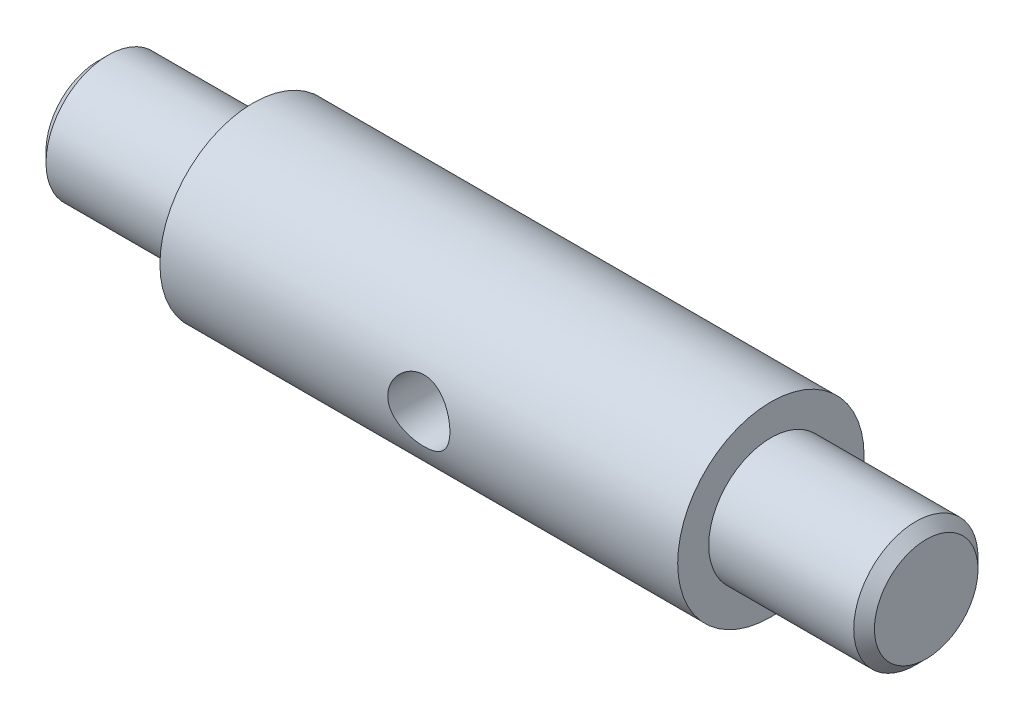
ISO-10303-21;
HEADER;
FILE_DESCRIPTION(('STEP AP214'),'2;1');
FILE_NAME('part.step','',(''),(''),'','','');
FILE_SCHEMA(('AUTOMOTIVE_DESIGN { 1 0 10303 214 1 1 1 1 }'));
ENDSEC;
DATA;
#1=APPLICATION_CONTEXT('core data for automotive mechanical design processes');
#2=APPLICATION_PROTOCOL_DEFINITION('international standard','automotive_design',2000,#1);
#3=PRODUCT_CONTEXT('',#1,'mechanical');
#4=PRODUCT('Part','Part','',(#3));
#5=PRODUCT_RELATED_PRODUCT_CATEGORY('part','',(#4));
#6=PRODUCT_DEFINITION_FORMATION('','',#4);
#7=PRODUCT_DEFINITION_CONTEXT('part definition',#1,'design');
#8=PRODUCT_DEFINITION('design','',#6,#7);
#9=PRODUCT_DEFINITION_SHAPE('','',#8);
#10=(LENGTH_UNIT() NAMED_UNIT(*) SI_UNIT(.MILLI.,.METRE.));
#11=(NAMED_UNIT(*) PLANE_ANGLE_UNIT() SI_UNIT($,.RADIAN.));
#12=(NAMED_UNIT(*) SI_UNIT($,.STERADIAN.) SOLID_ANGLE_UNIT());
#13=UNCERTAINTY_MEASURE_WITH_UNIT(LENGTH_MEASURE(1.E-05),#10,'distance_accuracy_value','');
#14=(GEOMETRIC_REPRESENTATION_CONTEXT(3) GLOBAL_UNCERTAINTY_ASSIGNED_CONTEXT((#13)) GLOBAL_UNIT_ASSIGNED_CONTEXT((#10,
#11,#12)) REPRESENTATION_CONTEXT('',''));
#15=CARTESIAN_POINT('',(0.,0.,0.));
#16=DIRECTION('',(0.,0.,1.));
#17=DIRECTION('',(1.,0.,0.));
#18=AXIS2_PLACEMENT_3D('',#15,#16,#17);
#19=CARTESIAN_POINT('',(40.,0.,-8.99999999999999));
#20=DIRECTION('',(0.,0.,1.));
#21=DIRECTION('',(1.,0.,0.));
#22=AXIS2_PLACEMENT_3D('',#19,#20,#21);
#23=CYLINDRICAL_SURFACE('',#22,3.);
#24=CARTESIAN_POINT('',(43.,0.,8.99999999999999));
#25=CARTESIAN_POINT('',(43.0000007611949,-0.16369008866017,9.00000045902832));
#26=CARTESIAN_POINT('',(42.9865592016184,-0.327375583615649,8.99549308522633));
#27=CARTESIAN_POINT('',(42.9333126735484,-0.649925282618916,8.97795630609841));
#28=CARTESIAN_POINT('',(42.8935049681532,-0.808788984356453,8.96492601606456));
#29=CARTESIAN_POINT('',(42.7890422698479,-1.11699836850533,8.93175923719327));
#30=CARTESIAN_POINT('',(42.7244288126222,-1.2663594776581,8.91163463192559));
#31=CARTESIAN_POINT('',(42.572376481485,-1.55212481041597,8.86633337152024));
#32=CARTESIAN_POINT('',(42.4849331049922,-1.68852647087612,8.84115572003333));
#33=CARTESIAN_POINT('',(42.2865225854237,-1.9492250250668,8.78742283329014));
#34=CARTESIAN_POINT('',(42.1749062972185,-2.07301110089493,8.75878669391353));
#35=CARTESIAN_POINT('',(41.9326985358803,-2.30049807810625,8.70180944349363));
#36=CARTESIAN_POINT('',(41.8021028952145,-2.40419455646839,8.67346839871646));
#37=CARTESIAN_POINT('',(41.5210446544106,-2.59147482668358,8.6193999743182));
#38=CARTESIAN_POINT('',(41.3701187808036,-2.67439457466309,8.59377117827063));
#39=CARTESIAN_POINT('',(41.0554717166244,-2.81345662163316,8.54925916255802));
#40=CARTESIAN_POINT('',(40.8917544485118,-2.8696070921603,8.53037388482235));
#41=CARTESIAN_POINT('',(40.5619803355099,-2.95162038452749,8.5023390980813));
#42=CARTESIAN_POINT('',(40.3961883745328,-2.97844034481531,8.49288287308832));
#43=CARTESIAN_POINT('',(40.0622087375324,-3.00402337000343,8.48386969888521));
#44=CARTESIAN_POINT('',(39.8940218178724,-3.00279510481416,8.48430969068189));
#45=CARTESIAN_POINT('',(39.5681901086679,-2.97305971111026,8.49477045024539));
#46=CARTESIAN_POINT('',(39.4104147912429,-2.94580173950099,8.50435247602597));
#47=CARTESIAN_POINT('',(39.1018197411795,-2.86681848854825,8.53129973173651));
#48=CARTESIAN_POINT('',(38.9510008436948,-2.81509027977562,8.54866589352321));
#49=CARTESIAN_POINT('',(38.6577617512256,-2.68781717418063,8.58953733393745));
#50=CARTESIAN_POINT('',(38.5155159235914,-2.61190214612179,8.61313697379351));
#51=CARTESIAN_POINT('',(38.2453872751608,-2.43866731890942,8.66377675727178));
#52=CARTESIAN_POINT('',(38.1175086191999,-2.34134133709202,8.69081789371389));
#53=CARTESIAN_POINT('',(37.8727252055177,-2.12204799804671,8.74701987503221));
#54=CARTESIAN_POINT('',(37.7567419164728,-1.99905945022894,8.77621768064527));
#55=CARTESIAN_POINT('',(37.5468062000098,-1.73501870991019,8.83220815161109));
#56=CARTESIAN_POINT('',(37.4528558855065,-1.59396478698245,8.85900058614201));
#57=CARTESIAN_POINT('',(37.2889110992948,-1.29584283913881,8.9075132381338));
#58=CARTESIAN_POINT('',(37.2191635259778,-1.13862982924901,8.92918050024116));
#59=CARTESIAN_POINT('',(37.1073904781329,-0.813807250093526,8.96461701433303));
#60=CARTESIAN_POINT('',(37.0653553737297,-0.646201314464865,8.97838900964637));
#61=CARTESIAN_POINT('',(37.0118330019329,-0.313151488587916,8.9960288121432));
#62=CARTESIAN_POINT('',(36.9991005724817,-0.147928799594542,9.00030005501183));
#63=CARTESIAN_POINT('',(37.0009980207954,0.18232520988071,8.99966708084481));
#64=CARTESIAN_POINT('',(37.0156232799396,0.34735655795895,8.99476441258086));
#65=CARTESIAN_POINT('',(37.0708357232079,0.667559598912767,8.97660074151312));
#66=CARTESIAN_POINT('',(37.1106586181485,0.822878420504531,8.96358596133576));
#67=CARTESIAN_POINT('',(37.2141803334002,1.12456787573872,8.93075540490209));
#68=CARTESIAN_POINT('',(37.2778821984034,1.27093736552582,8.91093876140024));
#69=CARTESIAN_POINT('',(37.4292112955224,1.55486488917982,8.86586793861868));
#70=CARTESIAN_POINT('',(37.5174237798495,1.69208987765144,8.84048444267357));
#71=CARTESIAN_POINT('',(37.7145824500404,1.95019449040676,8.78715761748786));
#72=CARTESIAN_POINT('',(37.8235349680953,2.07106910338673,8.75921350781481));
#73=CARTESIAN_POINT('',(38.0649362530198,2.2987575234189,8.70230543941333));
#74=CARTESIAN_POINT('',(38.1982276807806,2.40468290773731,8.67335283262282));
#75=CARTESIAN_POINT('',(38.4813147034327,2.59277256697072,8.61899919884125));
#76=CARTESIAN_POINT('',(38.6311104359022,2.67493664379304,8.59359820146005));
#77=CARTESIAN_POINT('',(38.9430190458697,2.81279079124909,8.54947175374149));
#78=CARTESIAN_POINT('',(39.1051062375063,2.86853439649506,8.53073282378935));
#79=CARTESIAN_POINT('',(39.4371359501324,2.95168400027807,8.50232496919347));
#80=CARTESIAN_POINT('',(39.607074896213,2.97910276486182,8.49265195870917));
#81=CARTESIAN_POINT('',(39.9405912881227,3.00382884743203,8.4839357662253));
#82=CARTESIAN_POINT('',(40.1040470208605,3.0026107719252,8.48437200772244));
#83=CARTESIAN_POINT('',(40.4282952247662,2.97372688034608,8.49453809471601));
#84=CARTESIAN_POINT('',(40.5890878538653,2.94606263837576,8.50426738708083));
#85=CARTESIAN_POINT('',(40.9004069890074,2.86611543938804,8.53153572914674));
#86=CARTESIAN_POINT('',(41.0510704750135,2.81431003804654,8.54892294067431));
#87=CARTESIAN_POINT('',(41.3416822208148,2.68793809727924,8.58949196455404));
#88=CARTESIAN_POINT('',(41.481628093564,2.61336650566142,8.61267506290178));
#89=CARTESIAN_POINT('',(41.7534510097687,2.43978207775029,8.66348487678137));
#90=CARTESIAN_POINT('',(41.8847095056952,2.33984472829374,8.6912613492641));
#91=CARTESIAN_POINT('',(42.1290694401526,2.11992864940694,8.74750068849757));
#92=CARTESIAN_POINT('',(42.2421657270642,1.99994425335444,8.77596374737116));
#93=CARTESIAN_POINT('',(42.4514332368675,1.73772467076206,8.83170091576631));
#94=CARTESIAN_POINT('',(42.546773043253,1.59480454049919,8.85888545403768));
#95=CARTESIAN_POINT('',(42.7119712865519,1.29407207221988,8.90777973517835));
#96=CARTESIAN_POINT('',(42.7818362377661,1.13626355439705,8.92949087723788));
#97=CARTESIAN_POINT('',(42.891164897466,0.817480941602931,8.96416545205624));
#98=CARTESIAN_POINT('',(42.9318473987901,0.656963273029228,8.97747637267566));
#99=CARTESIAN_POINT('',(42.9862608420314,0.330961248030742,8.99539221192664));
#100=CARTESIAN_POINT('',(42.9999992304896,0.16547827670624,8.99999953595714));
#101=CARTESIAN_POINT('',(43.,0.,8.99999999999999));
#102=B_SPLINE_CURVE_WITH_KNOTS('',3,(#24,#25,#26,#27,#28,#29,#30,#31,#32,#33,#34,#35,#36,#37,
#38,#39,#40,#41,#42,#43,#44,#45,#46,#47,#48,#49,#50,#51,#52,#53,#54,#55,#56,#57,#58,#59,#60,#61,
#62,#63,#64,#65,#66,#67,#68,#69,#70,#71,#72,#73,#74,#75,#76,#77,#78,#79,#80,#81,#82,#83,#84,#85,
#86,#87,#88,#89,#90,#91,#92,#93,#94,#95,#96,#97,#98,#99,#100,#101),.UNSPECIFIED.,.T.,.F.,(4,2,2,
2,2,2,2,2,2,2,2,2,2,2,2,2,2,2,2,2,2,2,2,2,2,2,2,2,2,2,2,2,2,2,2,2,2,2,4),(0.,0.490461318078033,
0.980973555802562,1.47066801861082,1.9604591333973,2.46554052848268,2.97073299862591,
3.49045154470411,4.010011340785,4.51205777225521,5.01394901962457,5.49290479653841,
5.97191792566446,6.45864513465392,6.94551307674622,7.45779917434101,7.97013437899855,
8.48755216951073,9.00479006631625,9.49960749525509,9.9943413949253,10.4747447393464,
10.9552093585231,11.4483119953121,11.9415654246567,12.4572306864226,12.9729002470499,
13.4875204148031,14.0019085411752,14.4898699819278,14.9778023805413,15.4564676124125,
15.9352391452793,16.4349020007542,16.9347063337134,17.453989825053,17.9731404345737,
18.4690967512144,18.9649159811442),.UNSPECIFIED.);
#103=CARTESIAN_POINT('',(43.,0.,8.99999999999999));
#104=VERTEX_POINT('',#103);
#105=EDGE_CURVE('E86',#104,#104,#102,.T.);
#106=ORIENTED_EDGE('',*,*,#105,.F.);
#107=EDGE_LOOP('',(#106));
#108=FACE_BOUND('',#107,.T.);
#109=CARTESIAN_POINT('',(40.,0.,0.));
#110=DIRECTION('',(0.707106781186547,0.,0.707106781186547));
#111=DIRECTION('',(-0.707106781186547,0.,0.707106781186547));
#112=AXIS2_PLACEMENT_3D('',#109,#110,#111);
#113=ELLIPSE('',#112,4.24264068711928,3.);
#114=CARTESIAN_POINT('',(40.,-3.,0.));
#115=VERTEX_POINT('',#114);
#116=CARTESIAN_POINT('',(40.,3.,0.));
#117=VERTEX_POINT('',#116);
#118=EDGE_CURVE('E49',#115,#117,#113,.F.);
#119=ORIENTED_EDGE('',*,*,#118,.T.);
#120=CARTESIAN_POINT('',(40.,0.,0.));
#121=DIRECTION('',(-0.707106781186547,0.,0.707106781186547));
#122=DIRECTION('',(0.707106781186547,0.,0.707106781186547));
#123=AXIS2_PLACEMENT_3D('',#120,#121,#122);
#124=ELLIPSE('',#123,4.24264068711928,3.);
#125=EDGE_CURVE('E11',#117,#115,#124,.F.);
#126=ORIENTED_EDGE('',*,*,#125,.T.);
#127=EDGE_LOOP('',(#119,#126));
#128=FACE_BOUND('',#127,.T.);
#129=ADVANCED_FACE('F35',(#108,#128),#23,.F.);
#130=CARTESIAN_POINT('',(0.,6.,0.));
#131=DIRECTION('',(1.,0.,0.));
#132=DIRECTION('',(0.,0.,-1.));
#133=AXIS2_PLACEMENT_3D('',#130,#131,#132);
#134=PLANE('',#133);
#135=CARTESIAN_POINT('',(0.,0.,0.));
#136=DIRECTION('',(-1.,0.,0.));
#137=DIRECTION('',(0.,0.,1.));
#138=AXIS2_PLACEMENT_3D('',#135,#136,#137);
#139=CIRCLE('',#138,2.99999999999999);
#140=CARTESIAN_POINT('',(0.,0.,2.99999999999999));
#141=VERTEX_POINT('',#140);
#142=EDGE_CURVE('E70',#141,#141,#139,.T.);
#143=ORIENTED_EDGE('',*,*,#142,.F.);
#144=EDGE_LOOP('',(#143));
#145=FACE_BOUND('',#144,.T.);
#146=CARTESIAN_POINT('',(0.,0.,0.));
#147=DIRECTION('',(1.,0.,0.));
#148=DIRECTION('',(0.,0.,-1.));
#149=AXIS2_PLACEMENT_3D('',#146,#147,#148);
#150=CIRCLE('',#149,5.);
#151=CARTESIAN_POINT('',(0.,0.,-5.));
#152=VERTEX_POINT('',#151);
#153=EDGE_CURVE('E170',#152,#152,#150,.F.);
#154=ORIENTED_EDGE('',*,*,#153,.T.);
#155=EDGE_LOOP('',(#154));
#156=FACE_BOUND('',#155,.T.);
#157=ADVANCED_FACE('F125',(#145,#156),#134,.F.);
#158=CARTESIAN_POINT('',(80.,0.,0.));
#159=DIRECTION('',(-1.,0.,0.));
#160=DIRECTION('',(0.,0.,1.));
#161=AXIS2_PLACEMENT_3D('',#158,#159,#160);
#162=PLANE('',#161);
#163=CARTESIAN_POINT('',(80.,0.,0.));
#164=DIRECTION('',(-1.,0.,0.));
#165=DIRECTION('',(0.,0.,1.));
#166=AXIS2_PLACEMENT_3D('',#163,#164,#165);
#167=CIRCLE('',#166,5.00000000000003);
#168=CARTESIAN_POINT('',(80.,0.,5.00000000000003));
#169=VERTEX_POINT('',#168);
#170=EDGE_CURVE('E167',#169,#169,#167,.F.);
#171=ORIENTED_EDGE('',*,*,#170,.T.);
#172=EDGE_LOOP('',(#171));
#173=FACE_BOUND('',#172,.T.);
#174=ADVANCED_FACE('F130',(#173),#162,.F.);
#175=CARTESIAN_POINT('',(0.,0.,0.));
#176=DIRECTION('',(-1.,0.,0.));
#177=DIRECTION('',(0.,0.,1.));
#178=AXIS2_PLACEMENT_3D('',#175,#176,#177);
#179=CYLINDRICAL_SURFACE('',#178,6.);
#180=CARTESIAN_POINT('',(79.,0.,0.));
#181=DIRECTION('',(-1.,0.,0.));
#182=DIRECTION('',(0.,0.,1.));
#183=AXIS2_PLACEMENT_3D('',#180,#181,#182);
#184=CIRCLE('',#183,6.);
#185=CARTESIAN_POINT('',(79.,0.,6.));
#186=VERTEX_POINT('',#185);
#187=EDGE_CURVE('E169',#186,#186,#184,.T.);
#188=ORIENTED_EDGE('',*,*,#187,.T.);
#189=EDGE_LOOP('',(#188));
#190=FACE_BOUND('',#189,.T.);
#191=CARTESIAN_POINT('',(65.,0.,0.));
#192=DIRECTION('',(-1.,0.,0.));
#193=DIRECTION('',(0.,0.,1.));
#194=AXIS2_PLACEMENT_3D('',#191,#192,#193);
#195=CIRCLE('',#194,5.99999999999999);
#196=CARTESIAN_POINT('',(65.,0.,5.99999999999999));
#197=VERTEX_POINT('',#196);
#198=EDGE_CURVE('E83',#197,#197,#195,.T.);
#199=ORIENTED_EDGE('',*,*,#198,.F.);
#200=EDGE_LOOP('',(#199));
#201=FACE_BOUND('',#200,.T.);
#202=ADVANCED_FACE('F142',(#190,#201),#179,.T.);
#203=CARTESIAN_POINT('',(65.,5.99999999999999,0.));
#204=DIRECTION('',(-1.,0.,0.));
#205=DIRECTION('',(0.,0.,1.));
#206=AXIS2_PLACEMENT_3D('',#203,#204,#205);
#207=PLANE('',#206);
#208=CARTESIAN_POINT('',(65.,0.,0.));
#209=DIRECTION('',(-1.,0.,0.));
#210=DIRECTION('',(0.,0.,1.));
#211=AXIS2_PLACEMENT_3D('',#208,#209,#210);
#212=CIRCLE('',#211,8.99999999999999);
#213=CARTESIAN_POINT('',(65.,0.,8.99999999999999));
#214=VERTEX_POINT('',#213);
#215=EDGE_CURVE('E80',#214,#214,#212,.T.);
#216=ORIENTED_EDGE('',*,*,#215,.F.);
#217=EDGE_LOOP('',(#216));
#218=FACE_BOUND('',#217,.T.);
#219=ORIENTED_EDGE('',*,*,#198,.T.);
#220=EDGE_LOOP('',(#219));
#221=FACE_BOUND('',#220,.T.);
#222=ADVANCED_FACE('F120',(#218,#221),#207,.F.);
#223=CARTESIAN_POINT('',(0.,0.,0.));
#224=DIRECTION('',(-1.,0.,0.));
#225=DIRECTION('',(0.,0.,1.));
#226=AXIS2_PLACEMENT_3D('',#223,#224,#225);
#227=CYLINDRICAL_SURFACE('',#226,8.99999999999999);
#228=CARTESIAN_POINT('',(43.,0.,-8.99999999999999));
#229=CARTESIAN_POINT('',(43.0000007611949,0.16369008866017,-9.00000045902831));
#230=CARTESIAN_POINT('',(42.9865592016184,0.32737558361565,-8.99549308522633));
#231=CARTESIAN_POINT('',(42.9333126735484,0.649925282618917,-8.97795630609841));
#232=CARTESIAN_POINT('',(42.8935049681532,0.808788984356453,-8.96492601606456));
#233=CARTESIAN_POINT('',(42.7890422698479,1.11699836850533,-8.93175923719327));
#234=CARTESIAN_POINT('',(42.7244288126222,1.2663594776581,-8.91163463192559));
#235=CARTESIAN_POINT('',(42.572376481485,1.55212481041597,-8.86633337152024));
#236=CARTESIAN_POINT('',(42.4849331049922,1.68852647087612,-8.84115572003332));
#237=CARTESIAN_POINT('',(42.2865225854237,1.9492250250668,-8.78742283329014));
#238=CARTESIAN_POINT('',(42.1749062972185,2.07301110089493,-8.75878669391353));
#239=CARTESIAN_POINT('',(41.9326985358803,2.30049807810625,-8.70180944349363));
#240=CARTESIAN_POINT('',(41.8021028952145,2.40419455646839,-8.67346839871646));
#241=CARTESIAN_POINT('',(41.5210446544106,2.59147482668358,-8.6193999743182));
#242=CARTESIAN_POINT('',(41.3701187808036,2.67439457466309,-8.59377117827063));
#243=CARTESIAN_POINT('',(41.0554717166244,2.81345662163316,-8.54925916255802));
#244=CARTESIAN_POINT('',(40.8917544485118,2.8696070921603,-8.53037388482235));
#245=CARTESIAN_POINT('',(40.5619803355099,2.95162038452749,-8.5023390980813));
#246=CARTESIAN_POINT('',(40.3961883745328,2.97844034481531,-8.49288287308832));
#247=CARTESIAN_POINT('',(40.0622087375324,3.00402337000343,-8.48386969888521));
#248=CARTESIAN_POINT('',(39.8940218178724,3.00279510481416,-8.48430969068189));
#249=CARTESIAN_POINT('',(39.5681901086679,2.97305971111026,-8.49477045024539));
#250=CARTESIAN_POINT('',(39.4104147912429,2.94580173950099,-8.50435247602597));
#251=CARTESIAN_POINT('',(39.1018197411795,2.86681848854825,-8.53129973173651));
#252=CARTESIAN_POINT('',(38.9510008436948,2.81509027977562,-8.54866589352321));
#253=CARTESIAN_POINT('',(38.6577617512256,2.68781717418063,-8.58953733393745));
#254=CARTESIAN_POINT('',(38.5155159235914,2.61190214612179,-8.61313697379351));
#255=CARTESIAN_POINT('',(38.2453872751608,2.43866731890942,-8.66377675727178));
#256=CARTESIAN_POINT('',(38.1175086191999,2.34134133709202,-8.69081789371389));
#257=CARTESIAN_POINT('',(37.8727252055177,2.12204799804671,-8.74701987503221));
#258=CARTESIAN_POINT('',(37.7567419164728,1.99905945022894,-8.77621768064527));
#259=CARTESIAN_POINT('',(37.5468062000098,1.73501870991019,-8.83220815161109));
#260=CARTESIAN_POINT('',(37.4528558855065,1.59396478698245,-8.85900058614201));
#261=CARTESIAN_POINT('',(37.2889110992948,1.29584283913881,-8.9075132381338));
#262=CARTESIAN_POINT('',(37.2191635259778,1.13862982924901,-8.92918050024116));
#263=CARTESIAN_POINT('',(37.1073904781329,0.813807250093526,-8.96461701433303));
#264=CARTESIAN_POINT('',(37.0653553737297,0.646201314464865,-8.97838900964637));
#265=CARTESIAN_POINT('',(37.0118330019329,0.313151488587916,-8.9960288121432));
#266=CARTESIAN_POINT('',(36.9991005724817,0.147928799594542,-9.00030005501183));
#267=CARTESIAN_POINT('',(37.0009980207954,-0.18232520988071,-8.99966708084481));
#268=CARTESIAN_POINT('',(37.0156232799396,-0.34735655795895,-8.99476441258086));
#269=CARTESIAN_POINT('',(37.0708357232079,-0.667559598912767,-8.97660074151312));
#270=CARTESIAN_POINT('',(37.1106586181485,-0.822878420504531,-8.96358596133576));
#271=CARTESIAN_POINT('',(37.2141803334002,-1.12456787573872,-8.93075540490209));
#272=CARTESIAN_POINT('',(37.2778821984034,-1.27093736552582,-8.91093876140024));
#273=CARTESIAN_POINT('',(37.4292112955224,-1.55486488917982,-8.86586793861868));
#274=CARTESIAN_POINT('',(37.5174237798495,-1.69208987765144,-8.84048444267357));
#275=CARTESIAN_POINT('',(37.7145824500404,-1.95019449040676,-8.78715761748786));
#276=CARTESIAN_POINT('',(37.8235349680953,-2.07106910338673,-8.75921350781481));
#277=CARTESIAN_POINT('',(38.0649362530198,-2.2987575234189,-8.70230543941333));
#278=CARTESIAN_POINT('',(38.1982276807806,-2.40468290773731,-8.67335283262282));
#279=CARTESIAN_POINT('',(38.4813147034327,-2.59277256697072,-8.61899919884125));
#280=CARTESIAN_POINT('',(38.6311104359022,-2.67493664379304,-8.59359820146005));
#281=CARTESIAN_POINT('',(38.9430190458697,-2.81279079124909,-8.54947175374149));
#282=CARTESIAN_POINT('',(39.1051062375063,-2.86853439649506,-8.53073282378935));
#283=CARTESIAN_POINT('',(39.4371359501324,-2.95168400027807,-8.50232496919347));
#284=CARTESIAN_POINT('',(39.607074896213,-2.97910276486182,-8.49265195870917));
#285=CARTESIAN_POINT('',(39.9405912881227,-3.00382884743203,-8.4839357662253));
#286=CARTESIAN_POINT('',(40.1040470208605,-3.0026107719252,-8.48437200772244));
#287=CARTESIAN_POINT('',(40.4282952247662,-2.97372688034608,-8.49453809471601));
#288=CARTESIAN_POINT('',(40.5890878538653,-2.94606263837576,-8.50426738708083));
#289=CARTESIAN_POINT('',(40.9004069890074,-2.86611543938804,-8.53153572914674));
#290=CARTESIAN_POINT('',(41.0510704750135,-2.81431003804654,-8.54892294067431));
#291=CARTESIAN_POINT('',(41.3416822208148,-2.68793809727924,-8.58949196455404));
#292=CARTESIAN_POINT('',(41.481628093564,-2.61336650566142,-8.61267506290178));
#293=CARTESIAN_POINT('',(41.7534510097687,-2.43978207775029,-8.66348487678137));
#294=CARTESIAN_POINT('',(41.8847095056952,-2.33984472829374,-8.6912613492641));
#295=CARTESIAN_POINT('',(42.1290694401526,-2.11992864940694,-8.74750068849757));
#296=CARTESIAN_POINT('',(42.2421657270642,-1.99994425335444,-8.77596374737116));
#297=CARTESIAN_POINT('',(42.4514332368675,-1.73772467076206,-8.83170091576631));
#298=CARTESIAN_POINT('',(42.546773043253,-1.59480454049919,-8.85888545403768));
#299=CARTESIAN_POINT('',(42.7119712865519,-1.29407207221988,-8.90777973517835));
#300=CARTESIAN_POINT('',(42.7818362377661,-1.13626355439705,-8.92949087723788));
#301=CARTESIAN_POINT('',(42.891164897466,-0.817480941602931,-8.96416545205624));
#302=CARTESIAN_POINT('',(42.9318473987901,-0.656963273029228,-8.97747637267567));
#303=CARTESIAN_POINT('',(42.9862608420314,-0.330961248030742,-8.99539221192664));
#304=CARTESIAN_POINT('',(42.9999992304896,-0.16547827670624,-8.99999953595713));
#305=CARTESIAN_POINT('',(43.,0.,-8.99999999999999));
#306=B_SPLINE_CURVE_WITH_KNOTS('',3,(#228,#229,#230,#231,#232,#233,#234,#235,#236,#237,#238,
#239,#240,#241,#242,#243,#244,#245,#246,#247,#248,#249,#250,#251,#252,#253,#254,#255,#256,#257,
#258,#259,#260,#261,#262,#263,#264,#265,#266,#267,#268,#269,#270,#271,#272,#273,#274,#275,#276,
#277,#278,#279,#280,#281,#282,#283,#284,#285,#286,#287,#288,#289,#290,#291,#292,#293,#294,#295,
#296,#297,#298,#299,#300,#301,#302,#303,#304,#305),.UNSPECIFIED.,.T.,.F.,(4,2,2,2,2,2,2,2,2,2,2,
2,2,2,2,2,2,2,2,2,2,2,2,2,2,2,2,2,2,2,2,2,2,2,2,2,2,2,4),(0.,0.490461318078033,
0.980973555802562,1.47066801861082,1.9604591333973,2.46554052848268,2.97073299862591,
3.49045154470411,4.010011340785,4.51205777225521,5.01394901962457,5.49290479653841,
5.97191792566446,6.45864513465392,6.94551307674622,7.45779917434101,7.97013437899855,
8.48755216951073,9.00479006631625,9.49960749525509,9.9943413949253,10.4747447393464,
10.9552093585231,11.4483119953121,11.9415654246567,12.4572306864226,12.9729002470499,
13.4875204148031,14.0019085411752,14.4898699819277,14.9778023805413,15.4564676124125,
15.9352391452793,16.4349020007541,16.9347063337134,17.453989825053,17.9731404345737,
18.4690967512144,18.9649159811442),.UNSPECIFIED.);
#307=CARTESIAN_POINT('',(43.,0.,-8.99999999999999));
#308=VERTEX_POINT('',#307);
#309=EDGE_CURVE('E94',#308,#308,#306,.T.);
#310=ORIENTED_EDGE('',*,*,#309,.T.);
#311=EDGE_LOOP('',(#310));
#312=FACE_BOUND('',#311,.T.);
#313=ORIENTED_EDGE('',*,*,#105,.T.);
#314=EDGE_LOOP('',(#313));
#315=FACE_BOUND('',#314,.T.);
#316=CARTESIAN_POINT('',(15.,0.,0.));
#317=DIRECTION('',(-1.,0.,0.));
#318=DIRECTION('',(0.,0.,1.));
#319=AXIS2_PLACEMENT_3D('',#316,#317,#318);
#320=CIRCLE('',#319,8.99999999999998);
#321=CARTESIAN_POINT('',(15.,0.,8.99999999999998));
#322=VERTEX_POINT('',#321);
#323=EDGE_CURVE('E73',#322,#322,#320,.T.);
#324=ORIENTED_EDGE('',*,*,#323,.F.);
#325=EDGE_LOOP('',(#324));
#326=FACE_BOUND('',#325,.T.);
#327=ORIENTED_EDGE('',*,*,#215,.T.);
#328=EDGE_LOOP('',(#327));
#329=FACE_BOUND('',#328,.T.);
#330=ADVANCED_FACE('F99',(#312,#315,#326,#329),#227,.T.);
#331=CARTESIAN_POINT('',(15.,8.99999999999998,0.));
#332=DIRECTION('',(1.,0.,0.));
#333=DIRECTION('',(0.,0.,-1.));
#334=AXIS2_PLACEMENT_3D('',#331,#332,#333);
#335=PLANE('',#334);
#336=CARTESIAN_POINT('',(15.,0.,0.));
#337=DIRECTION('',(-1.,0.,0.));
#338=DIRECTION('',(0.,0.,1.));
#339=AXIS2_PLACEMENT_3D('',#336,#337,#338);
#340=CIRCLE('',#339,6.);
#341=CARTESIAN_POINT('',(15.,0.,6.));
#342=VERTEX_POINT('',#341);
#343=EDGE_CURVE('E69',#342,#342,#340,.T.);
#344=ORIENTED_EDGE('',*,*,#343,.F.);
#345=EDGE_LOOP('',(#344));
#346=FACE_BOUND('',#345,.T.);
#347=ORIENTED_EDGE('',*,*,#323,.T.);
#348=EDGE_LOOP('',(#347));
#349=FACE_BOUND('',#348,.T.);
#350=ADVANCED_FACE('F113',(#346,#349),#335,.F.);
#351=CARTESIAN_POINT('',(0.,0.,0.));
#352=DIRECTION('',(-1.,0.,0.));
#353=DIRECTION('',(0.,0.,1.));
#354=AXIS2_PLACEMENT_3D('',#351,#352,#353);
#355=CYLINDRICAL_SURFACE('',#354,6.);
#356=CARTESIAN_POINT('',(1.,0.,0.));
#357=DIRECTION('',(1.,0.,0.));
#358=DIRECTION('',(0.,0.,-1.));
#359=AXIS2_PLACEMENT_3D('',#356,#357,#358);
#360=CIRCLE('',#359,6.);
#361=CARTESIAN_POINT('',(1.,0.,-6.));
#362=VERTEX_POINT('',#361);
#363=EDGE_CURVE('E176',#362,#362,#360,.T.);
#364=ORIENTED_EDGE('',*,*,#363,.T.);
#365=EDGE_LOOP('',(#364));
#366=FACE_BOUND('',#365,.T.);
#367=ORIENTED_EDGE('',*,*,#343,.T.);
#368=EDGE_LOOP('',(#367));
#369=FACE_BOUND('',#368,.T.);
#370=ADVANCED_FACE('F108',(#366,#369),#355,.T.);
#371=CARTESIAN_POINT('',(40.,0.,0.));
#372=DIRECTION('',(0.707106781186547,0.,0.707106781186547));
#373=DIRECTION('',(-0.707106781186547,0.,0.707106781186547));
#374=AXIS2_PLACEMENT_3D('',#371,#372,#373);
#375=ELLIPSE('',#374,4.24264068711928,3.);
#376=EDGE_CURVE('E56',#115,#117,#375,.T.);
#377=ORIENTED_EDGE('',*,*,#376,.T.);
#378=CARTESIAN_POINT('',(40.,0.,0.));
#379=DIRECTION('',(-0.707106781186547,0.,0.707106781186547));
#380=DIRECTION('',(0.707106781186547,0.,0.707106781186547));
#381=AXIS2_PLACEMENT_3D('',#378,#379,#380);
#382=ELLIPSE('',#381,4.24264068711928,3.);
#383=EDGE_CURVE('E44',#117,#115,#382,.T.);
#384=ORIENTED_EDGE('',*,*,#383,.T.);
#385=EDGE_LOOP('',(#377,#384));
#386=FACE_BOUND('',#385,.T.);
#387=ORIENTED_EDGE('',*,*,#309,.F.);
#388=EDGE_LOOP('',(#387));
#389=FACE_BOUND('',#388,.T.);
#390=ADVANCED_FACE('F103',(#386,#389),#23,.F.);
#391=CARTESIAN_POINT('',(79.,0.,0.));
#392=DIRECTION('',(-1.,0.,0.));
#393=DIRECTION('',(0.,0.,1.));
#394=AXIS2_PLACEMENT_3D('',#391,#392,#393);
#395=CONICAL_SURFACE('',#394,6.,0.785398163397447);
#396=ORIENTED_EDGE('',*,*,#170,.F.);
#397=EDGE_LOOP('',(#396));
#398=FACE_BOUND('',#397,.T.);
#399=ORIENTED_EDGE('',*,*,#187,.F.);
#400=EDGE_LOOP('',(#399));
#401=FACE_BOUND('',#400,.T.);
#402=ADVANCED_FACE('F107',(#398,#401),#395,.T.);
#403=CARTESIAN_POINT('',(0.,0.,0.));
#404=DIRECTION('',(1.,0.,0.));
#405=DIRECTION('',(0.,0.,-1.));
#406=AXIS2_PLACEMENT_3D('',#403,#404,#405);
#407=CONICAL_SURFACE('',#406,5.,0.785398163397445);
#408=ORIENTED_EDGE('',*,*,#363,.F.);
#409=EDGE_LOOP('',(#408));
#410=FACE_BOUND('',#409,.T.);
#411=ORIENTED_EDGE('',*,*,#153,.F.);
#412=EDGE_LOOP('',(#411));
#413=FACE_BOUND('',#412,.T.);
#414=ADVANCED_FACE('F38',(#410,#413),#407,.T.);
#415=CARTESIAN_POINT('',(0.,0.,0.));
#416=DIRECTION('',(-1.,0.,0.));
#417=DIRECTION('',(0.,0.,1.));
#418=AXIS2_PLACEMENT_3D('',#415,#416,#417);
#419=CYLINDRICAL_SURFACE('',#418,2.99999999999999);
#420=ORIENTED_EDGE('',*,*,#142,.T.);
#421=EDGE_LOOP('',(#420));
#422=FACE_BOUND('',#421,.T.);
#423=ORIENTED_EDGE('',*,*,#118,.F.);
#424=ORIENTED_EDGE('',*,*,#383,.F.);
#425=EDGE_LOOP('',(#423,#424));
#426=FACE_BOUND('',#425,.T.);
#427=ADVANCED_FACE('F162',(#422,#426),#419,.F.);
#428=CARTESIAN_POINT('',(45.,0.,0.));
#429=DIRECTION('',(-1.,0.,0.));
#430=DIRECTION('',(0.,0.,1.));
#431=AXIS2_PLACEMENT_3D('',#428,#429,#430);
#432=CIRCLE('',#431,2.99999999999999);
#433=CARTESIAN_POINT('',(45.,0.,2.99999999999999));
#434=VERTEX_POINT('',#433);
#435=EDGE_CURVE('E67',#434,#434,#432,.T.);
#436=ORIENTED_EDGE('',*,*,#435,.F.);
#437=EDGE_LOOP('',(#436));
#438=FACE_BOUND('',#437,.T.);
#439=ORIENTED_EDGE('',*,*,#376,.F.);
#440=ORIENTED_EDGE('',*,*,#125,.F.);
#441=EDGE_LOOP('',(#439,#440));
#442=FACE_BOUND('',#441,.T.);
#443=ADVANCED_FACE('F63',(#438,#442),#419,.F.);
#444=CARTESIAN_POINT('',(45.,0.,0.));
#445=DIRECTION('',(-1.,0.,0.));
#446=DIRECTION('',(0.,0.,1.));
#447=AXIS2_PLACEMENT_3D('',#444,#445,#446);
#448=CONICAL_SURFACE('',#447,2.99999999999999,1.02974425867665);
#449=CARTESIAN_POINT('',(46.8025818570827,0.,0.));
#450=VERTEX_POINT('',#449);
#451=VERTEX_LOOP('',#450);
#452=FACE_BOUND('',#451,.T.);
#453=ORIENTED_EDGE('',*,*,#435,.T.);
#454=EDGE_LOOP('',(#453));
#455=FACE_BOUND('',#454,.T.);
#456=ADVANCED_FACE('F60',(#452,#455),#448,.F.);
#457=CLOSED_SHELL('',(#129,#157,#174,#202,#222,#330,#350,#370,#390,#402,#414,#427,#443,#456));
#458=MANIFOLD_SOLID_BREP('B2',#457);
#459=ADVANCED_BREP_SHAPE_REPRESENTATION('',(#18,#458),#14);
#460=SHAPE_DEFINITION_REPRESENTATION(#9,#459);
ENDSEC;
END-ISO-10303-21;
